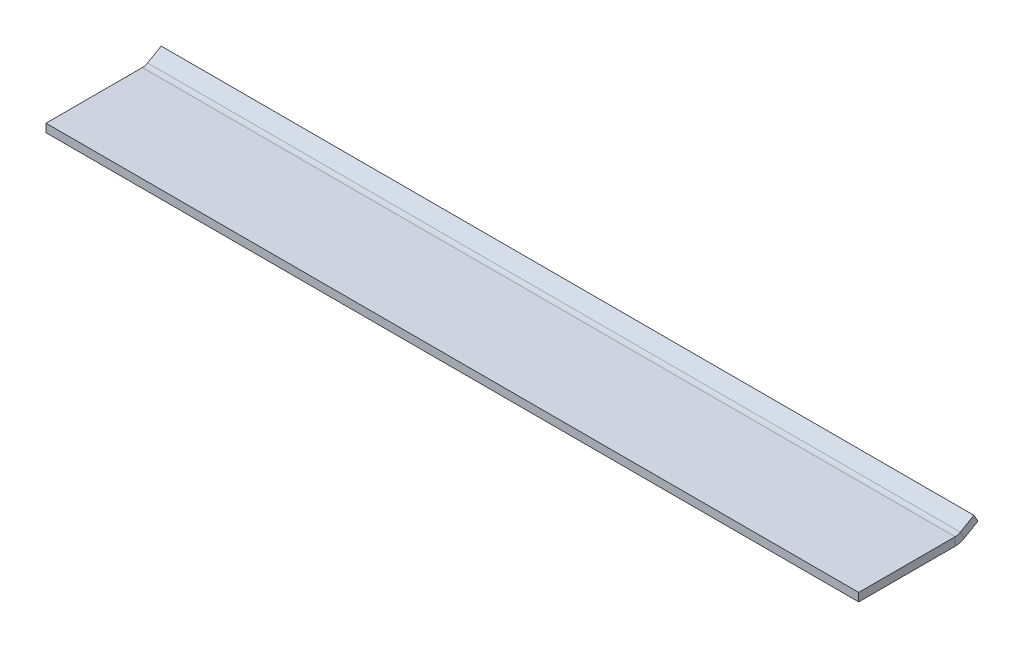
ISO-10303-21;
HEADER;
FILE_DESCRIPTION(('STEP AP214'),'2;1');
FILE_NAME('part.step','',(''),(''),'','','');
FILE_SCHEMA(('AUTOMOTIVE_DESIGN { 1 0 10303 214 1 1 1 1 }'));
ENDSEC;
DATA;
#1=APPLICATION_CONTEXT('core data for automotive mechanical design processes');
#2=APPLICATION_PROTOCOL_DEFINITION('international standard','automotive_design',2000,#1);
#3=PRODUCT_CONTEXT('',#1,'mechanical');
#4=PRODUCT('Part','Part','',(#3));
#5=PRODUCT_RELATED_PRODUCT_CATEGORY('part','',(#4));
#6=PRODUCT_DEFINITION_FORMATION('','',#4);
#7=PRODUCT_DEFINITION_CONTEXT('part definition',#1,'design');
#8=PRODUCT_DEFINITION('design','',#6,#7);
#9=PRODUCT_DEFINITION_SHAPE('','',#8);
#10=(LENGTH_UNIT() NAMED_UNIT(*) SI_UNIT(.MILLI.,.METRE.));
#11=(NAMED_UNIT(*) PLANE_ANGLE_UNIT() SI_UNIT($,.RADIAN.));
#12=(NAMED_UNIT(*) SI_UNIT($,.STERADIAN.) SOLID_ANGLE_UNIT());
#13=UNCERTAINTY_MEASURE_WITH_UNIT(LENGTH_MEASURE(1.E-05),#10,'distance_accuracy_value','');
#14=(GEOMETRIC_REPRESENTATION_CONTEXT(3) GLOBAL_UNCERTAINTY_ASSIGNED_CONTEXT((#13)) GLOBAL_UNIT_ASSIGNED_CONTEXT((#10,
#11,#12)) REPRESENTATION_CONTEXT('',''));
#15=CARTESIAN_POINT('',(0.,0.,0.));
#16=DIRECTION('',(0.,0.,1.));
#17=DIRECTION('',(1.,0.,0.));
#18=AXIS2_PLACEMENT_3D('',#15,#16,#17);
#19=CARTESIAN_POINT('',(-590.,-12.,84.));
#20=DIRECTION('',(-1.,0.,0.));
#21=DIRECTION('',(0.,0.,1.));
#22=AXIS2_PLACEMENT_3D('',#19,#20,#21);
#23=PLANE('',#22);
#24=DIRECTION('',(0.,0.,1.));
#25=VECTOR('',#24,1.);
#26=CARTESIAN_POINT('',(-590.,0.,84.));
#27=LINE('',#26,#25);
#28=CARTESIAN_POINT('',(-590.,0.,-55.980762113533));
#29=VERTEX_POINT('',#28);
#30=CARTESIAN_POINT('',(-590.,0.,84.));
#31=VERTEX_POINT('',#30);
#32=EDGE_CURVE('E104',#29,#31,#27,.T.);
#33=ORIENTED_EDGE('',*,*,#32,.F.);
#34=DIRECTION('',(0.,-1.,0.));
#35=VECTOR('',#34,1.);
#36=CARTESIAN_POINT('',(-590.,0.,-55.980762113533));
#37=LINE('',#36,#35);
#38=CARTESIAN_POINT('',(-590.,-12.,-55.980762113533));
#39=VERTEX_POINT('',#38);
#40=EDGE_CURVE('E117',#29,#39,#37,.T.);
#41=ORIENTED_EDGE('',*,*,#40,.T.);
#42=DIRECTION('',(0.,0.,1.));
#43=VECTOR('',#42,1.);
#44=CARTESIAN_POINT('',(-590.,-12.,84.));
#45=LINE('',#44,#43);
#46=CARTESIAN_POINT('',(-590.,-12.,84.));
#47=VERTEX_POINT('',#46);
#48=EDGE_CURVE('E111',#39,#47,#45,.T.);
#49=ORIENTED_EDGE('',*,*,#48,.T.);
#50=DIRECTION('',(0.,1.,0.));
#51=VECTOR('',#50,1.);
#52=CARTESIAN_POINT('',(-590.,-12.,84.));
#53=LINE('',#52,#51);
#54=EDGE_CURVE('E60',#47,#31,#53,.T.);
#55=ORIENTED_EDGE('',*,*,#54,.T.);
#56=EDGE_LOOP('',(#33,#41,#49,#55));
#57=FACE_BOUND('',#56,.T.);
#58=ADVANCED_FACE('F56',(#57),#23,.T.);
#59=CARTESIAN_POINT('',(0.,-12.,0.));
#60=DIRECTION('',(0.,-1.,0.));
#61=DIRECTION('',(0.,0.,-1.));
#62=AXIS2_PLACEMENT_3D('',#59,#60,#61);
#63=PLANE('',#62);
#64=ORIENTED_EDGE('',*,*,#48,.F.);
#65=DIRECTION('',(-1.,0.,0.));
#66=VECTOR('',#65,1.);
#67=CARTESIAN_POINT('',(-590.,-12.,-55.980762113533));
#68=LINE('',#67,#66);
#69=CARTESIAN_POINT('',(590.,-12.,-55.980762113533));
#70=VERTEX_POINT('',#69);
#71=EDGE_CURVE('E134',#39,#70,#68,.F.);
#72=ORIENTED_EDGE('',*,*,#71,.T.);
#73=DIRECTION('',(0.,0.,-1.));
#74=VECTOR('',#73,1.);
#75=CARTESIAN_POINT('',(590.,-12.,84.));
#76=LINE('',#75,#74);
#77=CARTESIAN_POINT('',(590.,-12.,84.));
#78=VERTEX_POINT('',#77);
#79=EDGE_CURVE('E109',#78,#70,#76,.T.);
#80=ORIENTED_EDGE('',*,*,#79,.F.);
#81=DIRECTION('',(1.,0.,0.));
#82=VECTOR('',#81,1.);
#83=CARTESIAN_POINT('',(-590.,-12.,84.));
#84=LINE('',#83,#82);
#85=EDGE_CURVE('E96',#47,#78,#84,.T.);
#86=ORIENTED_EDGE('',*,*,#85,.F.);
#87=EDGE_LOOP('',(#64,#72,#80,#86));
#88=FACE_BOUND('',#87,.T.);
#89=ADVANCED_FACE('F224',(#88),#63,.T.);
#90=CARTESIAN_POINT('',(0.,0.,0.));
#91=DIRECTION('',(0.,-1.,0.));
#92=DIRECTION('',(0.,0.,-1.));
#93=AXIS2_PLACEMENT_3D('',#90,#91,#92);
#94=PLANE('',#93);
#95=DIRECTION('',(-1.,0.,0.));
#96=VECTOR('',#95,1.);
#97=CARTESIAN_POINT('',(-590.,0.,-55.980762113533));
#98=LINE('',#97,#96);
#99=CARTESIAN_POINT('',(590.,0.,-55.980762113533));
#100=VERTEX_POINT('',#99);
#101=EDGE_CURVE('E124',#29,#100,#98,.F.);
#102=ORIENTED_EDGE('',*,*,#101,.F.);
#103=ORIENTED_EDGE('',*,*,#32,.T.);
#104=DIRECTION('',(1.,0.,0.));
#105=VECTOR('',#104,1.);
#106=CARTESIAN_POINT('',(-590.,0.,84.));
#107=LINE('',#106,#105);
#108=CARTESIAN_POINT('',(590.,0.,84.));
#109=VERTEX_POINT('',#108);
#110=EDGE_CURVE('E94',#31,#109,#107,.T.);
#111=ORIENTED_EDGE('',*,*,#110,.T.);
#112=DIRECTION('',(0.,0.,-1.));
#113=VECTOR('',#112,1.);
#114=CARTESIAN_POINT('',(590.,0.,84.));
#115=LINE('',#114,#113);
#116=EDGE_CURVE('E99',#109,#100,#115,.T.);
#117=ORIENTED_EDGE('',*,*,#116,.T.);
#118=EDGE_LOOP('',(#102,#103,#111,#117));
#119=FACE_BOUND('',#118,.T.);
#120=ADVANCED_FACE('F106',(#119),#94,.F.);
#121=CARTESIAN_POINT('',(590.,-12.,84.));
#122=DIRECTION('',(1.,0.,0.));
#123=DIRECTION('',(0.,0.,-1.));
#124=AXIS2_PLACEMENT_3D('',#121,#122,#123);
#125=PLANE('',#124);
#126=DIRECTION('',(0.,-1.,0.));
#127=VECTOR('',#126,1.);
#128=CARTESIAN_POINT('',(590.,0.,-55.980762113533));
#129=LINE('',#128,#127);
#130=EDGE_CURVE('E101',#100,#70,#129,.T.);
#131=ORIENTED_EDGE('',*,*,#130,.F.);
#132=ORIENTED_EDGE('',*,*,#116,.F.);
#133=DIRECTION('',(0.,1.,0.));
#134=VECTOR('',#133,1.);
#135=CARTESIAN_POINT('',(590.,-12.,84.));
#136=LINE('',#135,#134);
#137=EDGE_CURVE('E13',#78,#109,#136,.T.);
#138=ORIENTED_EDGE('',*,*,#137,.F.);
#139=ORIENTED_EDGE('',*,*,#79,.T.);
#140=EDGE_LOOP('',(#131,#132,#138,#139));
#141=FACE_BOUND('',#140,.T.);
#142=ADVANCED_FACE('F58',(#141),#125,.T.);
#143=CARTESIAN_POINT('',(-590.,-12.,84.));
#144=DIRECTION('',(0.,0.,1.));
#145=DIRECTION('',(1.,0.,0.));
#146=AXIS2_PLACEMENT_3D('',#143,#144,#145);
#147=PLANE('',#146);
#148=ORIENTED_EDGE('',*,*,#110,.F.);
#149=ORIENTED_EDGE('',*,*,#54,.F.);
#150=ORIENTED_EDGE('',*,*,#85,.T.);
#151=ORIENTED_EDGE('',*,*,#137,.T.);
#152=EDGE_LOOP('',(#148,#149,#150,#151));
#153=FACE_BOUND('',#152,.T.);
#154=ADVANCED_FACE('F91',(#153),#147,.T.);
#155=CARTESIAN_POINT('',(590.,15.,-55.980762113533));
#156=DIRECTION('',(1.,0.,0.));
#157=DIRECTION('',(0.,0.,-1.));
#158=AXIS2_PLACEMENT_3D('',#155,#156,#157);
#159=PLANE('',#158);
#160=DIRECTION('',(0.,0.866025403784442,0.499999999999995));
#161=VECTOR('',#160,1.);
#162=CARTESIAN_POINT('',(590.,-8.38268590217992,-69.4807621135329));
#163=LINE('',#162,#161);
#164=CARTESIAN_POINT('',(590.,2.00961894323339,-63.480762113533));
#165=VERTEX_POINT('',#164);
#166=CARTESIAN_POINT('',(589.999999999999,-8.38268590217992,-69.4807621135329));
#167=VERTEX_POINT('',#166);
#168=EDGE_CURVE('E138',#165,#167,#163,.F.);
#169=ORIENTED_EDGE('',*,*,#168,.F.);
#170=CARTESIAN_POINT('',(590.,15.,-55.980762113533));
#171=DIRECTION('',(-1.,0.,0.));
#172=DIRECTION('',(0.,0.,1.));
#173=AXIS2_PLACEMENT_3D('',#170,#171,#172);
#174=CIRCLE('',#173,15.);
#175=EDGE_CURVE('E128',#100,#165,#174,.F.);
#176=ORIENTED_EDGE('',*,*,#175,.F.);
#177=ORIENTED_EDGE('',*,*,#130,.T.);
#178=CARTESIAN_POINT('',(589.999999999999,15.,-55.980762113533));
#179=DIRECTION('',(-1.,0.,0.));
#180=DIRECTION('',(0.,0.,1.));
#181=AXIS2_PLACEMENT_3D('',#178,#179,#180);
#182=CIRCLE('',#181,27.);
#183=EDGE_CURVE('E71',#70,#167,#182,.F.);
#184=ORIENTED_EDGE('',*,*,#183,.T.);
#185=EDGE_LOOP('',(#169,#176,#177,#184));
#186=FACE_BOUND('',#185,.T.);
#187=ADVANCED_FACE('F226',(#186),#159,.T.);
#188=CARTESIAN_POINT('',(-590.,15.,-55.980762113533));
#189=DIRECTION('',(1.,0.,0.));
#190=DIRECTION('',(0.,0.,-1.));
#191=AXIS2_PLACEMENT_3D('',#188,#189,#190);
#192=PLANE('',#191);
#193=CARTESIAN_POINT('',(-590.,15.,-55.980762113533));
#194=DIRECTION('',(-1.,0.,0.));
#195=DIRECTION('',(0.,0.,1.));
#196=AXIS2_PLACEMENT_3D('',#193,#194,#195);
#197=CIRCLE('',#196,15.);
#198=CARTESIAN_POINT('',(-590.,2.00961894323339,-63.480762113533));
#199=VERTEX_POINT('',#198);
#200=EDGE_CURVE('E121',#199,#29,#197,.T.);
#201=ORIENTED_EDGE('',*,*,#200,.F.);
#202=DIRECTION('',(0.,0.866025403784442,0.499999999999995));
#203=VECTOR('',#202,1.);
#204=CARTESIAN_POINT('',(-590.,2.00961894323339,-63.480762113533));
#205=LINE('',#204,#203);
#206=CARTESIAN_POINT('',(-590.,-8.38268590217991,-69.4807621135329));
#207=VERTEX_POINT('',#206);
#208=EDGE_CURVE('E144',#199,#207,#205,.F.);
#209=ORIENTED_EDGE('',*,*,#208,.T.);
#210=CARTESIAN_POINT('',(-590.,15.,-55.980762113533));
#211=DIRECTION('',(-1.,0.,0.));
#212=DIRECTION('',(0.,0.,1.));
#213=AXIS2_PLACEMENT_3D('',#210,#211,#212);
#214=CIRCLE('',#213,27.);
#215=EDGE_CURVE('E131',#207,#39,#214,.T.);
#216=ORIENTED_EDGE('',*,*,#215,.T.);
#217=ORIENTED_EDGE('',*,*,#40,.F.);
#218=EDGE_LOOP('',(#201,#209,#216,#217));
#219=FACE_BOUND('',#218,.T.);
#220=ADVANCED_FACE('F218',(#219),#192,.F.);
#221=CARTESIAN_POINT('',(-590.,15.,-55.980762113533));
#222=DIRECTION('',(-1.,0.,0.));
#223=DIRECTION('',(0.,-0.866025403784442,-0.499999999999995));
#224=AXIS2_PLACEMENT_3D('',#221,#222,#223);
#225=CYLINDRICAL_SURFACE('',#224,27.);
#226=ORIENTED_EDGE('',*,*,#71,.F.);
#227=ORIENTED_EDGE('',*,*,#215,.F.);
#228=DIRECTION('',(-1.,0.,0.));
#229=VECTOR('',#228,1.);
#230=CARTESIAN_POINT('',(590.,-8.38268590217992,-69.4807621135329));
#231=LINE('',#230,#229);
#232=EDGE_CURVE('E147',#207,#167,#231,.F.);
#233=ORIENTED_EDGE('',*,*,#232,.T.);
#234=ORIENTED_EDGE('',*,*,#183,.F.);
#235=EDGE_LOOP('',(#226,#227,#233,#234));
#236=FACE_BOUND('',#235,.T.);
#237=ADVANCED_FACE('F225',(#236),#225,.T.);
#238=CARTESIAN_POINT('',(-590.,15.,-55.980762113533));
#239=DIRECTION('',(-1.,0.,0.));
#240=DIRECTION('',(0.,-0.866025403784442,-0.499999999999995));
#241=AXIS2_PLACEMENT_3D('',#238,#239,#240);
#242=CYLINDRICAL_SURFACE('',#241,15.);
#243=ORIENTED_EDGE('',*,*,#101,.T.);
#244=ORIENTED_EDGE('',*,*,#175,.T.);
#245=DIRECTION('',(-1.,0.,0.));
#246=VECTOR('',#245,1.);
#247=CARTESIAN_POINT('',(590.,2.00961894323338,-63.4807621135329));
#248=LINE('',#247,#246);
#249=EDGE_CURVE('E141',#165,#199,#248,.T.);
#250=ORIENTED_EDGE('',*,*,#249,.T.);
#251=ORIENTED_EDGE('',*,*,#200,.T.);
#252=EDGE_LOOP('',(#243,#244,#250,#251));
#253=FACE_BOUND('',#252,.T.);
#254=ADVANCED_FACE('F220',(#253),#242,.F.);
#255=CARTESIAN_POINT('',(590.,-10.3923048454133,-65.9999999999997));
#256=DIRECTION('',(-1.,0.,0.));
#257=DIRECTION('',(0.,0.,1.));
#258=AXIS2_PLACEMENT_3D('',#255,#256,#257);
#259=PLANE('',#258);
#260=ORIENTED_EDGE('',*,*,#168,.T.);
#261=DIRECTION('',(0.,-0.499999999999995,0.866025403784442));
#262=VECTOR('',#261,1.);
#263=CARTESIAN_POINT('',(590.000000000001,-46.7653718043558,-3.00000000000564));
#264=LINE('',#263,#262);
#265=CARTESIAN_POINT('',(590.,2.99999999999985,-89.1961524227065));
#266=VERTEX_POINT('',#265);
#267=EDGE_CURVE('E158',#266,#167,#264,.T.);
#268=ORIENTED_EDGE('',*,*,#267,.F.);
#269=DIRECTION('',(0.,0.866025403784442,0.499999999999995));
#270=VECTOR('',#269,1.);
#271=CARTESIAN_POINT('',(590.,2.99999999999985,-89.1961524227065));
#272=LINE('',#271,#270);
#273=CARTESIAN_POINT('',(590.,13.3923048454131,-83.1961524227065));
#274=VERTEX_POINT('',#273);
#275=EDGE_CURVE('E167',#266,#274,#272,.T.);
#276=ORIENTED_EDGE('',*,*,#275,.T.);
#277=DIRECTION('',(0.,0.499999999999995,-0.866025403784442));
#278=VECTOR('',#277,1.);
#279=CARTESIAN_POINT('',(590.,0.,-59.9999999999998));
#280=LINE('',#279,#278);
#281=EDGE_CURVE('E149',#274,#165,#280,.F.);
#282=ORIENTED_EDGE('',*,*,#281,.T.);
#283=EDGE_LOOP('',(#260,#268,#276,#282));
#284=FACE_BOUND('',#283,.T.);
#285=ADVANCED_FACE('F193',(#284),#259,.F.);
#286=CARTESIAN_POINT('',(-590.,2.99999999999985,-89.1961524227065));
#287=DIRECTION('',(1.,0.,0.));
#288=DIRECTION('',(0.,0.,-1.));
#289=AXIS2_PLACEMENT_3D('',#286,#287,#288);
#290=PLANE('',#289);
#291=ORIENTED_EDGE('',*,*,#208,.F.);
#292=DIRECTION('',(0.,-0.499999999999995,0.866025403784442));
#293=VECTOR('',#292,1.);
#294=CARTESIAN_POINT('',(-590.,13.3923048454131,-83.1961524227065));
#295=LINE('',#294,#293);
#296=CARTESIAN_POINT('',(-590.,13.3923048454131,-83.1961524227065));
#297=VERTEX_POINT('',#296);
#298=EDGE_CURVE('E152',#199,#297,#295,.F.);
#299=ORIENTED_EDGE('',*,*,#298,.T.);
#300=DIRECTION('',(0.,0.866025403784442,0.499999999999995));
#301=VECTOR('',#300,1.);
#302=CARTESIAN_POINT('',(-590.,2.99999999999985,-89.1961524227065));
#303=LINE('',#302,#301);
#304=CARTESIAN_POINT('',(-590.,2.99999999999984,-89.1961524227065));
#305=VERTEX_POINT('',#304);
#306=EDGE_CURVE('E125',#305,#297,#303,.T.);
#307=ORIENTED_EDGE('',*,*,#306,.F.);
#308=DIRECTION('',(0.,0.499999999999995,-0.866025403784442));
#309=VECTOR('',#308,1.);
#310=CARTESIAN_POINT('',(-589.999999999999,-46.7653718043644,-2.99999999999081));
#311=LINE('',#310,#309);
#312=EDGE_CURVE('E161',#207,#305,#311,.T.);
#313=ORIENTED_EDGE('',*,*,#312,.F.);
#314=EDGE_LOOP('',(#291,#299,#307,#313));
#315=FACE_BOUND('',#314,.T.);
#316=ADVANCED_FACE('F215',(#315),#290,.F.);
#317=CARTESIAN_POINT('',(0.,-46.7653718043595,-2.99999999999928));
#318=DIRECTION('',(0.,0.866025403784442,0.499999999999995));
#319=DIRECTION('',(0.,-0.499999999999995,0.866025403784442));
#320=AXIS2_PLACEMENT_3D('',#317,#318,#319);
#321=PLANE('',#320);
#322=ORIENTED_EDGE('',*,*,#232,.F.);
#323=ORIENTED_EDGE('',*,*,#312,.T.);
#324=DIRECTION('',(1.,0.,0.));
#325=VECTOR('',#324,1.);
#326=CARTESIAN_POINT('',(0.,2.99999999999984,-89.1961524227065));
#327=LINE('',#326,#325);
#328=EDGE_CURVE('E164',#305,#266,#327,.T.);
#329=ORIENTED_EDGE('',*,*,#328,.T.);
#330=ORIENTED_EDGE('',*,*,#267,.T.);
#331=EDGE_LOOP('',(#322,#323,#329,#330));
#332=FACE_BOUND('',#331,.T.);
#333=ADVANCED_FACE('F213',(#332),#321,.F.);
#334=CARTESIAN_POINT('',(0.,-36.3730669589462,3.00000000000066));
#335=DIRECTION('',(0.,0.866025403784442,0.499999999999995));
#336=DIRECTION('',(0.,-0.499999999999995,0.866025403784442));
#337=AXIS2_PLACEMENT_3D('',#334,#335,#336);
#338=PLANE('',#337);
#339=ORIENTED_EDGE('',*,*,#298,.F.);
#340=ORIENTED_EDGE('',*,*,#249,.F.);
#341=ORIENTED_EDGE('',*,*,#281,.F.);
#342=DIRECTION('',(-1.,0.,0.));
#343=VECTOR('',#342,1.);
#344=CARTESIAN_POINT('',(590.,13.3923048454131,-83.1961524227065));
#345=LINE('',#344,#343);
#346=EDGE_CURVE('E155',#297,#274,#345,.F.);
#347=ORIENTED_EDGE('',*,*,#346,.F.);
#348=EDGE_LOOP('',(#339,#340,#341,#347));
#349=FACE_BOUND('',#348,.T.);
#350=ADVANCED_FACE('F187',(#349),#338,.T.);
#351=CARTESIAN_POINT('',(590.,2.99999999999985,-89.1961524227065));
#352=DIRECTION('',(0.,-0.499999999999995,0.866025403784441));
#353=DIRECTION('',(0.,-0.866025403784442,-0.499999999999995));
#354=AXIS2_PLACEMENT_3D('',#351,#352,#353);
#355=PLANE('',#354);
#356=ORIENTED_EDGE('',*,*,#346,.T.);
#357=ORIENTED_EDGE('',*,*,#275,.F.);
#358=ORIENTED_EDGE('',*,*,#328,.F.);
#359=ORIENTED_EDGE('',*,*,#306,.T.);
#360=EDGE_LOOP('',(#356,#357,#358,#359));
#361=FACE_BOUND('',#360,.T.);
#362=ADVANCED_FACE('F176',(#361),#355,.F.);
#363=CLOSED_SHELL('',(#58,#89,#120,#142,#154,#187,#220,#237,#254,#285,#316,#333,#350,#362));
#364=MANIFOLD_SOLID_BREP('B2',#363);
#365=ADVANCED_BREP_SHAPE_REPRESENTATION('',(#18,#364),#14);
#366=SHAPE_DEFINITION_REPRESENTATION(#9,#365);
ENDSEC;
END-ISO-10303-21;
